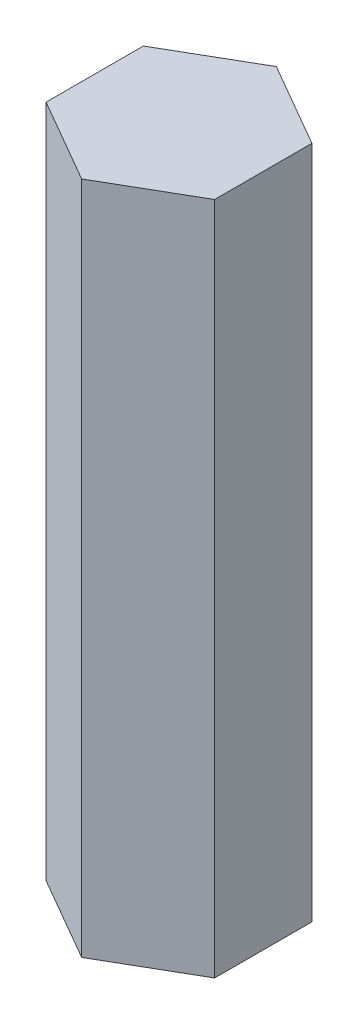
ISO-10303-21;
HEADER;
FILE_DESCRIPTION(('STEP AP214'),'2;1');
FILE_NAME('part.step','',(''),(''),'','','');
FILE_SCHEMA(('AUTOMOTIVE_DESIGN { 1 0 10303 214 1 1 1 1 }'));
ENDSEC;
DATA;
#1=APPLICATION_CONTEXT('core data for automotive mechanical design processes');
#2=APPLICATION_PROTOCOL_DEFINITION('international standard','automotive_design',2000,#1);
#3=PRODUCT_CONTEXT('',#1,'mechanical');
#4=PRODUCT('Part','Part','',(#3));
#5=PRODUCT_RELATED_PRODUCT_CATEGORY('part','',(#4));
#6=PRODUCT_DEFINITION_FORMATION('','',#4);
#7=PRODUCT_DEFINITION_CONTEXT('part definition',#1,'design');
#8=PRODUCT_DEFINITION('design','',#6,#7);
#9=PRODUCT_DEFINITION_SHAPE('','',#8);
#10=(LENGTH_UNIT() NAMED_UNIT(*) SI_UNIT(.MILLI.,.METRE.));
#11=(NAMED_UNIT(*) PLANE_ANGLE_UNIT() SI_UNIT($,.RADIAN.));
#12=(NAMED_UNIT(*) SI_UNIT($,.STERADIAN.) SOLID_ANGLE_UNIT());
#13=UNCERTAINTY_MEASURE_WITH_UNIT(LENGTH_MEASURE(1.E-05),#10,'distance_accuracy_value','');
#14=(GEOMETRIC_REPRESENTATION_CONTEXT(3) GLOBAL_UNCERTAINTY_ASSIGNED_CONTEXT((#13)) GLOBAL_UNIT_ASSIGNED_CONTEXT((#10,
#11,#12)) REPRESENTATION_CONTEXT('',''));
#15=CARTESIAN_POINT('',(0.,0.,0.));
#16=DIRECTION('',(0.,0.,1.));
#17=DIRECTION('',(1.,0.,0.));
#18=AXIS2_PLACEMENT_3D('',#15,#16,#17);
#19=CARTESIAN_POINT('',(0.,20.,2.88675134594813));
#20=DIRECTION('',(-0.499999999999999,0.,-0.866025403784439));
#21=DIRECTION('',(-0.866025403784439,0.,0.499999999999999));
#22=AXIS2_PLACEMENT_3D('',#19,#20,#21);
#23=PLANE('',#22);
#24=DIRECTION('',(0.866025403784439,0.,-0.499999999999999));
#25=VECTOR('',#24,1.);
#26=CARTESIAN_POINT('',(0.,0.,2.88675134594813));
#27=LINE('',#26,#25);
#28=CARTESIAN_POINT('',(0.,0.,2.88675134594813));
#29=VERTEX_POINT('',#28);
#30=CARTESIAN_POINT('',(2.5,0.,1.44337567297407));
#31=VERTEX_POINT('',#30);
#32=EDGE_CURVE('E134',#29,#31,#27,.T.);
#33=ORIENTED_EDGE('',*,*,#32,.T.);
#34=DIRECTION('',(0.,-1.,0.));
#35=VECTOR('',#34,1.);
#36=CARTESIAN_POINT('',(2.5,20.,1.44337567297407));
#37=LINE('',#36,#35);
#38=CARTESIAN_POINT('',(2.5,20.,1.44337567297407));
#39=VERTEX_POINT('',#38);
#40=EDGE_CURVE('E11',#39,#31,#37,.T.);
#41=ORIENTED_EDGE('',*,*,#40,.F.);
#42=DIRECTION('',(0.866025403784439,0.,-0.499999999999999));
#43=VECTOR('',#42,1.);
#44=CARTESIAN_POINT('',(0.,20.,2.88675134594813));
#45=LINE('',#44,#43);
#46=CARTESIAN_POINT('',(0.,20.,2.88675134594813));
#47=VERTEX_POINT('',#46);
#48=EDGE_CURVE('E150',#47,#39,#45,.T.);
#49=ORIENTED_EDGE('',*,*,#48,.F.);
#50=DIRECTION('',(0.,-1.,0.));
#51=VECTOR('',#50,1.);
#52=CARTESIAN_POINT('',(0.,20.,2.88675134594813));
#53=LINE('',#52,#51);
#54=EDGE_CURVE('E130',#47,#29,#53,.T.);
#55=ORIENTED_EDGE('',*,*,#54,.T.);
#56=EDGE_LOOP('',(#33,#41,#49,#55));
#57=FACE_BOUND('',#56,.T.);
#58=ADVANCED_FACE('F45',(#57),#23,.F.);
#59=CARTESIAN_POINT('',(2.5,20.,1.44337567297407));
#60=DIRECTION('',(-1.,0.,0.));
#61=DIRECTION('',(0.,0.,1.));
#62=AXIS2_PLACEMENT_3D('',#59,#60,#61);
#63=PLANE('',#62);
#64=DIRECTION('',(0.,0.,-1.));
#65=VECTOR('',#64,1.);
#66=CARTESIAN_POINT('',(2.5,0.,1.44337567297407));
#67=LINE('',#66,#65);
#68=CARTESIAN_POINT('',(2.5,0.,-1.44337567297406));
#69=VERTEX_POINT('',#68);
#70=EDGE_CURVE('E138',#31,#69,#67,.T.);
#71=ORIENTED_EDGE('',*,*,#70,.T.);
#72=DIRECTION('',(0.,-1.,0.));
#73=VECTOR('',#72,1.);
#74=CARTESIAN_POINT('',(2.5,20.,-1.44337567297406));
#75=LINE('',#74,#73);
#76=CARTESIAN_POINT('',(2.5,20.,-1.44337567297406));
#77=VERTEX_POINT('',#76);
#78=EDGE_CURVE('E54',#77,#69,#75,.T.);
#79=ORIENTED_EDGE('',*,*,#78,.F.);
#80=DIRECTION('',(0.,0.,-1.));
#81=VECTOR('',#80,1.);
#82=CARTESIAN_POINT('',(2.5,20.,1.44337567297407));
#83=LINE('',#82,#81);
#84=EDGE_CURVE('E99',#39,#77,#83,.T.);
#85=ORIENTED_EDGE('',*,*,#84,.F.);
#86=ORIENTED_EDGE('',*,*,#40,.T.);
#87=EDGE_LOOP('',(#71,#79,#85,#86));
#88=FACE_BOUND('',#87,.T.);
#89=ADVANCED_FACE('F178',(#88),#63,.F.);
#90=CARTESIAN_POINT('',(2.5,20.,-1.44337567297406));
#91=DIRECTION('',(-0.5,0.,0.866025403784438));
#92=DIRECTION('',(0.866025403784439,0.,0.5));
#93=AXIS2_PLACEMENT_3D('',#90,#91,#92);
#94=PLANE('',#93);
#95=DIRECTION('',(-0.866025403784438,0.,-0.5));
#96=VECTOR('',#95,1.);
#97=CARTESIAN_POINT('',(2.5,0.,-1.44337567297406));
#98=LINE('',#97,#96);
#99=CARTESIAN_POINT('',(0.,0.,-2.88675134594813));
#100=VERTEX_POINT('',#99);
#101=EDGE_CURVE('E141',#69,#100,#98,.T.);
#102=ORIENTED_EDGE('',*,*,#101,.T.);
#103=DIRECTION('',(0.,-1.,0.));
#104=VECTOR('',#103,1.);
#105=CARTESIAN_POINT('',(0.,20.,-2.88675134594813));
#106=LINE('',#105,#104);
#107=CARTESIAN_POINT('',(0.,20.,-2.88675134594813));
#108=VERTEX_POINT('',#107);
#109=EDGE_CURVE('E123',#108,#100,#106,.T.);
#110=ORIENTED_EDGE('',*,*,#109,.F.);
#111=DIRECTION('',(-0.866025403784438,0.,-0.5));
#112=VECTOR('',#111,1.);
#113=CARTESIAN_POINT('',(2.5,20.,-1.44337567297406));
#114=LINE('',#113,#112);
#115=EDGE_CURVE('E112',#77,#108,#114,.T.);
#116=ORIENTED_EDGE('',*,*,#115,.F.);
#117=ORIENTED_EDGE('',*,*,#78,.T.);
#118=EDGE_LOOP('',(#102,#110,#116,#117));
#119=FACE_BOUND('',#118,.T.);
#120=ADVANCED_FACE('F160',(#119),#94,.F.);
#121=CARTESIAN_POINT('',(0.,20.,-2.88675134594813));
#122=DIRECTION('',(0.5,0.,0.866025403784439));
#123=DIRECTION('',(0.866025403784439,0.,-0.5));
#124=AXIS2_PLACEMENT_3D('',#121,#122,#123);
#125=PLANE('',#124);
#126=DIRECTION('',(-0.866025403784439,0.,0.5));
#127=VECTOR('',#126,1.);
#128=CARTESIAN_POINT('',(0.,0.,-2.88675134594813));
#129=LINE('',#128,#127);
#130=CARTESIAN_POINT('',(-2.5,0.,-1.44337567297407));
#131=VERTEX_POINT('',#130);
#132=EDGE_CURVE('E121',#100,#131,#129,.T.);
#133=ORIENTED_EDGE('',*,*,#132,.T.);
#134=DIRECTION('',(0.,-1.,0.));
#135=VECTOR('',#134,1.);
#136=CARTESIAN_POINT('',(-2.5,20.,-1.44337567297407));
#137=LINE('',#136,#135);
#138=CARTESIAN_POINT('',(-2.5,20.,-1.44337567297407));
#139=VERTEX_POINT('',#138);
#140=EDGE_CURVE('E118',#139,#131,#137,.T.);
#141=ORIENTED_EDGE('',*,*,#140,.F.);
#142=DIRECTION('',(-0.866025403784439,0.,0.5));
#143=VECTOR('',#142,1.);
#144=CARTESIAN_POINT('',(0.,20.,-2.88675134594813));
#145=LINE('',#144,#143);
#146=EDGE_CURVE('E106',#108,#139,#145,.T.);
#147=ORIENTED_EDGE('',*,*,#146,.F.);
#148=ORIENTED_EDGE('',*,*,#109,.T.);
#149=EDGE_LOOP('',(#133,#141,#147,#148));
#150=FACE_BOUND('',#149,.T.);
#151=ADVANCED_FACE('F119',(#150),#125,.F.);
#152=CARTESIAN_POINT('',(-2.5,20.,-1.44337567297407));
#153=DIRECTION('',(1.,0.,0.));
#154=DIRECTION('',(0.,0.,-1.));
#155=AXIS2_PLACEMENT_3D('',#152,#153,#154);
#156=PLANE('',#155);
#157=DIRECTION('',(0.,0.,1.));
#158=VECTOR('',#157,1.);
#159=CARTESIAN_POINT('',(-2.5,0.,-1.44337567297407));
#160=LINE('',#159,#158);
#161=CARTESIAN_POINT('',(-2.5,0.,1.44337567297406));
#162=VERTEX_POINT('',#161);
#163=EDGE_CURVE('E85',#131,#162,#160,.T.);
#164=ORIENTED_EDGE('',*,*,#163,.T.);
#165=DIRECTION('',(0.,-1.,0.));
#166=VECTOR('',#165,1.);
#167=CARTESIAN_POINT('',(-2.5,20.,1.44337567297406));
#168=LINE('',#167,#166);
#169=CARTESIAN_POINT('',(-2.5,20.,1.44337567297406));
#170=VERTEX_POINT('',#169);
#171=EDGE_CURVE('E124',#170,#162,#168,.T.);
#172=ORIENTED_EDGE('',*,*,#171,.F.);
#173=DIRECTION('',(0.,0.,1.));
#174=VECTOR('',#173,1.);
#175=CARTESIAN_POINT('',(-2.5,20.,-1.44337567297407));
#176=LINE('',#175,#174);
#177=EDGE_CURVE('E110',#139,#170,#176,.T.);
#178=ORIENTED_EDGE('',*,*,#177,.F.);
#179=ORIENTED_EDGE('',*,*,#140,.T.);
#180=EDGE_LOOP('',(#164,#172,#178,#179));
#181=FACE_BOUND('',#180,.T.);
#182=ADVANCED_FACE('F126',(#181),#156,.F.);
#183=CARTESIAN_POINT('',(-2.5,20.,1.44337567297406));
#184=DIRECTION('',(0.5,0.,-0.866025403784438));
#185=DIRECTION('',(-0.866025403784438,0.,-0.5));
#186=AXIS2_PLACEMENT_3D('',#183,#184,#185);
#187=PLANE('',#186);
#188=DIRECTION('',(0.866025403784438,0.,0.5));
#189=VECTOR('',#188,1.);
#190=CARTESIAN_POINT('',(-2.5,0.,1.44337567297406));
#191=LINE('',#190,#189);
#192=EDGE_CURVE('E91',#162,#29,#191,.T.);
#193=ORIENTED_EDGE('',*,*,#192,.T.);
#194=ORIENTED_EDGE('',*,*,#54,.F.);
#195=DIRECTION('',(0.866025403784438,0.,0.5));
#196=VECTOR('',#195,1.);
#197=CARTESIAN_POINT('',(-2.5,20.,1.44337567297406));
#198=LINE('',#197,#196);
#199=EDGE_CURVE('E62',#170,#47,#198,.T.);
#200=ORIENTED_EDGE('',*,*,#199,.F.);
#201=ORIENTED_EDGE('',*,*,#171,.T.);
#202=EDGE_LOOP('',(#193,#194,#200,#201));
#203=FACE_BOUND('',#202,.T.);
#204=ADVANCED_FACE('F167',(#203),#187,.F.);
#205=CARTESIAN_POINT('',(0.,20.,0.));
#206=DIRECTION('',(0.,1.,0.));
#207=DIRECTION('',(0.,0.,1.));
#208=AXIS2_PLACEMENT_3D('',#205,#206,#207);
#209=PLANE('',#208);
#210=ORIENTED_EDGE('',*,*,#48,.T.);
#211=ORIENTED_EDGE('',*,*,#84,.T.);
#212=ORIENTED_EDGE('',*,*,#115,.T.);
#213=ORIENTED_EDGE('',*,*,#146,.T.);
#214=ORIENTED_EDGE('',*,*,#177,.T.);
#215=ORIENTED_EDGE('',*,*,#199,.T.);
#216=EDGE_LOOP('',(#210,#211,#212,#213,#214,#215));
#217=FACE_BOUND('',#216,.T.);
#218=ADVANCED_FACE('F108',(#217),#209,.T.);
#219=CARTESIAN_POINT('',(0.,0.,0.));
#220=DIRECTION('',(0.,1.,0.));
#221=DIRECTION('',(0.,0.,1.));
#222=AXIS2_PLACEMENT_3D('',#219,#220,#221);
#223=PLANE('',#222);
#224=ORIENTED_EDGE('',*,*,#32,.F.);
#225=ORIENTED_EDGE('',*,*,#192,.F.);
#226=ORIENTED_EDGE('',*,*,#163,.F.);
#227=ORIENTED_EDGE('',*,*,#132,.F.);
#228=ORIENTED_EDGE('',*,*,#101,.F.);
#229=ORIENTED_EDGE('',*,*,#70,.F.);
#230=EDGE_LOOP('',(#224,#225,#226,#227,#228,#229));
#231=FACE_BOUND('',#230,.T.);
#232=ADVANCED_FACE('F163',(#231),#223,.F.);
#233=CLOSED_SHELL('',(#58,#89,#120,#151,#182,#204,#218,#232));
#234=MANIFOLD_SOLID_BREP('B2',#233);
#235=ADVANCED_BREP_SHAPE_REPRESENTATION('',(#18,#234),#14);
#236=SHAPE_DEFINITION_REPRESENTATION(#9,#235);
ENDSEC;
END-ISO-10303-21;
